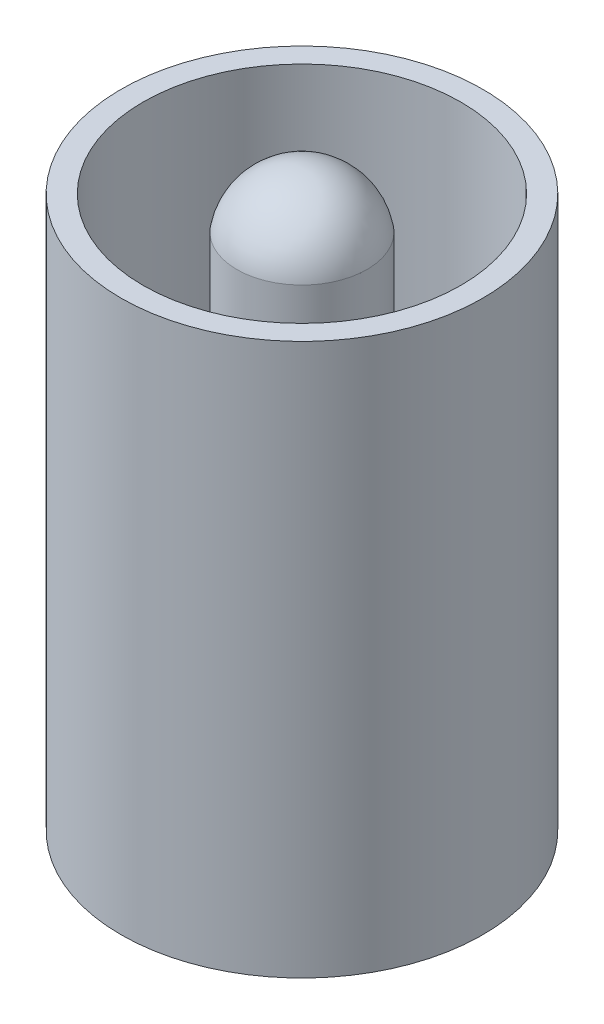
ISO-10303-21;
HEADER;
FILE_DESCRIPTION(('STEP AP214'),'2;1');
FILE_NAME('part.step','',(''),(''),'','','');
FILE_SCHEMA(('AUTOMOTIVE_DESIGN { 1 0 10303 214 1 1 1 1 }'));
ENDSEC;
DATA;
#1=APPLICATION_CONTEXT('core data for automotive mechanical design processes');
#2=APPLICATION_PROTOCOL_DEFINITION('international standard','automotive_design',2000,#1);
#3=PRODUCT_CONTEXT('',#1,'mechanical');
#4=PRODUCT('Part','Part','',(#3));
#5=PRODUCT_RELATED_PRODUCT_CATEGORY('part','',(#4));
#6=PRODUCT_DEFINITION_FORMATION('','',#4);
#7=PRODUCT_DEFINITION_CONTEXT('part definition',#1,'design');
#8=PRODUCT_DEFINITION('design','',#6,#7);
#9=PRODUCT_DEFINITION_SHAPE('','',#8);
#10=(LENGTH_UNIT() NAMED_UNIT(*) SI_UNIT(.MILLI.,.METRE.));
#11=(NAMED_UNIT(*) PLANE_ANGLE_UNIT() SI_UNIT($,.RADIAN.));
#12=(NAMED_UNIT(*) SI_UNIT($,.STERADIAN.) SOLID_ANGLE_UNIT());
#13=UNCERTAINTY_MEASURE_WITH_UNIT(LENGTH_MEASURE(1.E-05),#10,'distance_accuracy_value','');
#14=(GEOMETRIC_REPRESENTATION_CONTEXT(3) GLOBAL_UNCERTAINTY_ASSIGNED_CONTEXT((#13)) GLOBAL_UNIT_ASSIGNED_CONTEXT((#10,
#11,#12)) REPRESENTATION_CONTEXT('',''));
#15=CARTESIAN_POINT('',(0.,0.,0.));
#16=DIRECTION('',(0.,0.,1.));
#17=DIRECTION('',(1.,0.,0.));
#18=AXIS2_PLACEMENT_3D('',#15,#16,#17);
#19=CARTESIAN_POINT('',(0.,0.508,0.));
#20=DIRECTION('',(0.,1.,0.));
#21=DIRECTION('',(0.,0.,1.));
#22=AXIS2_PLACEMENT_3D('',#19,#20,#21);
#23=PLANE('',#22);
#24=CARTESIAN_POINT('',(0.,0.508,0.));
#25=DIRECTION('',(0.,1.,0.));
#26=DIRECTION('',(0.,0.,1.));
#27=AXIS2_PLACEMENT_3D('',#24,#25,#26);
#28=CIRCLE('',#27,3.6591875);
#29=CARTESIAN_POINT('',(0.,0.508,3.6591875));
#30=VERTEX_POINT('',#29);
#31=EDGE_CURVE('E48',#30,#30,#28,.T.);
#32=ORIENTED_EDGE('',*,*,#31,.T.);
#33=EDGE_LOOP('',(#32));
#34=FACE_BOUND('',#33,.T.);
#35=CARTESIAN_POINT('',(0.,0.508,0.));
#36=DIRECTION('',(0.,1.,0.));
#37=DIRECTION('',(0.,0.,1.));
#38=AXIS2_PLACEMENT_3D('',#35,#36,#37);
#39=CIRCLE('',#38,1.5);
#40=CARTESIAN_POINT('',(0.,0.508,1.5));
#41=VERTEX_POINT('',#40);
#42=EDGE_CURVE('E51',#41,#41,#39,.T.);
#43=ORIENTED_EDGE('',*,*,#42,.F.);
#44=EDGE_LOOP('',(#43));
#45=FACE_BOUND('',#44,.T.);
#46=ADVANCED_FACE('F31',(#34,#45),#23,.T.);
#47=CARTESIAN_POINT('',(0.,12.7,0.));
#48=DIRECTION('',(0.,-1.,0.));
#49=DIRECTION('',(0.,0.,-1.));
#50=AXIS2_PLACEMENT_3D('',#47,#48,#49);
#51=CYLINDRICAL_SURFACE('',#50,4.1671875);
#52=CARTESIAN_POINT('',(0.,12.7,0.));
#53=DIRECTION('',(0.,1.,0.));
#54=DIRECTION('',(0.,0.,1.));
#55=AXIS2_PLACEMENT_3D('',#52,#53,#54);
#56=CIRCLE('',#55,4.1671875);
#57=CARTESIAN_POINT('',(0.,12.7,4.1671875));
#58=VERTEX_POINT('',#57);
#59=EDGE_CURVE('E10',#58,#58,#56,.T.);
#60=ORIENTED_EDGE('',*,*,#59,.F.);
#61=EDGE_LOOP('',(#60));
#62=FACE_BOUND('',#61,.T.);
#63=CARTESIAN_POINT('',(0.,0.,0.));
#64=DIRECTION('',(0.,1.,0.));
#65=DIRECTION('',(0.,0.,1.));
#66=AXIS2_PLACEMENT_3D('',#63,#64,#65);
#67=CIRCLE('',#66,4.1671875);
#68=CARTESIAN_POINT('',(0.,0.,4.1671875));
#69=VERTEX_POINT('',#68);
#70=EDGE_CURVE('E39',#69,#69,#67,.T.);
#71=ORIENTED_EDGE('',*,*,#70,.T.);
#72=EDGE_LOOP('',(#71));
#73=FACE_BOUND('',#72,.T.);
#74=ADVANCED_FACE('F71',(#62,#73),#51,.T.);
#75=CARTESIAN_POINT('',(0.,12.7,0.));
#76=DIRECTION('',(0.,1.,0.));
#77=DIRECTION('',(0.,0.,1.));
#78=AXIS2_PLACEMENT_3D('',#75,#76,#77);
#79=PLANE('',#78);
#80=CARTESIAN_POINT('',(0.,12.7,0.));
#81=DIRECTION('',(0.,1.,0.));
#82=DIRECTION('',(0.,0.,1.));
#83=AXIS2_PLACEMENT_3D('',#80,#81,#82);
#84=CIRCLE('',#83,3.6591875);
#85=CARTESIAN_POINT('',(0.,12.7,3.6591875));
#86=VERTEX_POINT('',#85);
#87=EDGE_CURVE('E44',#86,#86,#84,.T.);
#88=ORIENTED_EDGE('',*,*,#87,.F.);
#89=EDGE_LOOP('',(#88));
#90=FACE_BOUND('',#89,.T.);
#91=ORIENTED_EDGE('',*,*,#59,.T.);
#92=EDGE_LOOP('',(#91));
#93=FACE_BOUND('',#92,.T.);
#94=ADVANCED_FACE('F77',(#90,#93),#79,.T.);
#95=CARTESIAN_POINT('',(0.,0.,0.));
#96=DIRECTION('',(0.,1.,0.));
#97=DIRECTION('',(0.,0.,1.));
#98=AXIS2_PLACEMENT_3D('',#95,#96,#97);
#99=PLANE('',#98);
#100=ORIENTED_EDGE('',*,*,#70,.F.);
#101=EDGE_LOOP('',(#100));
#102=FACE_BOUND('',#101,.T.);
#103=ADVANCED_FACE('F67',(#102),#99,.F.);
#104=CARTESIAN_POINT('',(0.,12.7,0.));
#105=DIRECTION('',(0.,-1.,0.));
#106=DIRECTION('',(0.,0.,-1.));
#107=AXIS2_PLACEMENT_3D('',#104,#105,#106);
#108=CYLINDRICAL_SURFACE('',#107,3.6591875);
#109=ORIENTED_EDGE('',*,*,#87,.T.);
#110=EDGE_LOOP('',(#109));
#111=FACE_BOUND('',#110,.T.);
#112=ORIENTED_EDGE('',*,*,#31,.F.);
#113=EDGE_LOOP('',(#112));
#114=FACE_BOUND('',#113,.T.);
#115=ADVANCED_FACE('F61',(#111,#114),#108,.F.);
#116=CARTESIAN_POINT('',(0.,11.938,0.));
#117=DIRECTION('',(0.,-1.,0.));
#118=DIRECTION('',(0.,0.,-1.));
#119=AXIS2_PLACEMENT_3D('',#116,#117,#118);
#120=CYLINDRICAL_SURFACE('',#119,1.5);
#121=CARTESIAN_POINT('',(0.,11.938,0.));
#122=DIRECTION('',(0.,1.,0.));
#123=DIRECTION('',(0.,0.,1.));
#124=AXIS2_PLACEMENT_3D('',#121,#122,#123);
#125=CIRCLE('',#124,1.5);
#126=CARTESIAN_POINT('',(0.,11.938,1.5));
#127=VERTEX_POINT('',#126);
#128=EDGE_CURVE('E35',#127,#127,#125,.T.);
#129=ORIENTED_EDGE('',*,*,#128,.F.);
#130=EDGE_LOOP('',(#129));
#131=FACE_BOUND('',#130,.T.);
#132=ORIENTED_EDGE('',*,*,#42,.T.);
#133=EDGE_LOOP('',(#132));
#134=FACE_BOUND('',#133,.T.);
#135=ADVANCED_FACE('F59',(#131,#134),#120,.T.);
#136=CARTESIAN_POINT('',(0.,11.6871732283465,0.));
#137=DIRECTION('',(0.,0.,1.));
#138=DIRECTION('',(1.,0.,0.));
#139=AXIS2_PLACEMENT_3D('',#136,#137,#138);
#140=SPHERICAL_SURFACE('',#139,1.52082677165354);
#141=CARTESIAN_POINT('',(0.,11.6871732283465,0.));
#142=DIRECTION('',(0.,1.,0.));
#143=DIRECTION('',(0.,0.,1.));
#144=AXIS2_PLACEMENT_3D('',#141,#142,#143);
#145=SPHERICAL_SURFACE('',#144,1.52082677165354);
#146=ORIENTED_EDGE('',*,*,#128,.T.);
#147=EDGE_LOOP('',(#146));
#148=FACE_BOUND('',#147,.T.);
#149=ADVANCED_FACE('F33',(#148),#145,.T.);
#150=CLOSED_SHELL('',(#46,#74,#94,#103,#115,#135,#149));
#151=MANIFOLD_SOLID_BREP('B2',#150);
#152=ADVANCED_BREP_SHAPE_REPRESENTATION('',(#18,#151),#14);
#153=SHAPE_DEFINITION_REPRESENTATION(#9,#152);
ENDSEC;
END-ISO-10303-21;
